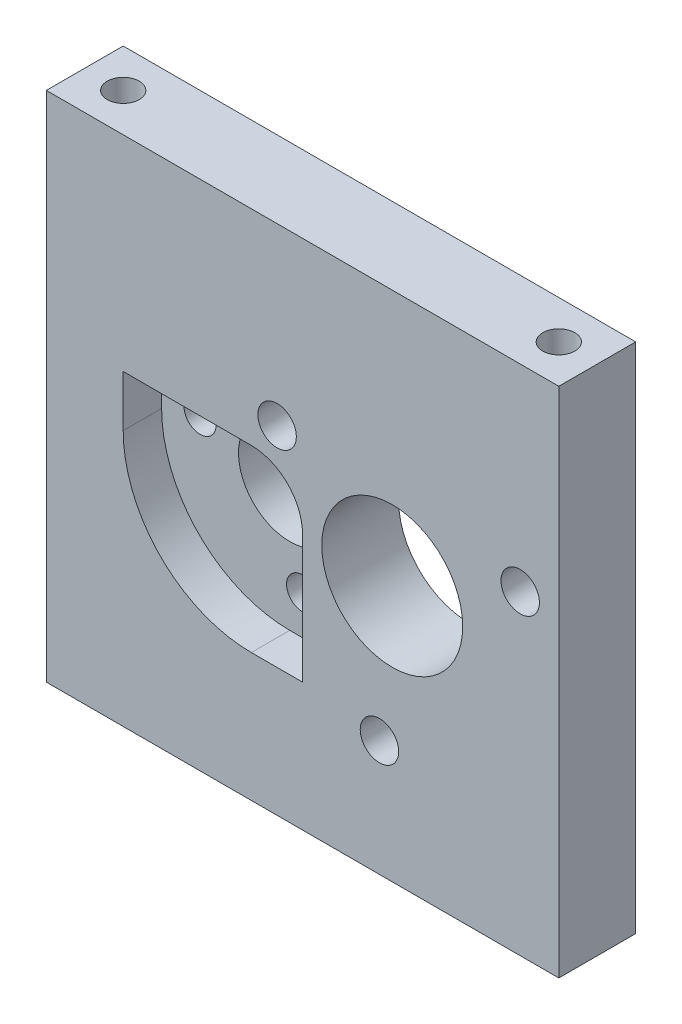
ISO-10303-21;
HEADER;
FILE_DESCRIPTION(('STEP AP214'),'2;1');
FILE_NAME('part.step','',(''),(''),'','','');
FILE_SCHEMA(('AUTOMOTIVE_DESIGN { 1 0 10303 214 1 1 1 1 }'));
ENDSEC;
DATA;
#1=APPLICATION_CONTEXT('core data for automotive mechanical design processes');
#2=APPLICATION_PROTOCOL_DEFINITION('international standard','automotive_design',2000,#1);
#3=PRODUCT_CONTEXT('',#1,'mechanical');
#4=PRODUCT('Part','Part','',(#3));
#5=PRODUCT_RELATED_PRODUCT_CATEGORY('part','',(#4));
#6=PRODUCT_DEFINITION_FORMATION('','',#4);
#7=PRODUCT_DEFINITION_CONTEXT('part definition',#1,'design');
#8=PRODUCT_DEFINITION('design','',#6,#7);
#9=PRODUCT_DEFINITION_SHAPE('','',#8);
#10=(LENGTH_UNIT() NAMED_UNIT(*) SI_UNIT(.MILLI.,.METRE.));
#11=(NAMED_UNIT(*) PLANE_ANGLE_UNIT() SI_UNIT($,.RADIAN.));
#12=(NAMED_UNIT(*) SI_UNIT($,.STERADIAN.) SOLID_ANGLE_UNIT());
#13=UNCERTAINTY_MEASURE_WITH_UNIT(LENGTH_MEASURE(1.E-05),#10,'distance_accuracy_value','');
#14=(GEOMETRIC_REPRESENTATION_CONTEXT(3) GLOBAL_UNCERTAINTY_ASSIGNED_CONTEXT((#13)) GLOBAL_UNIT_ASSIGNED_CONTEXT((#10,
#11,#12)) REPRESENTATION_CONTEXT('',''));
#15=CARTESIAN_POINT('',(0.,0.,0.));
#16=DIRECTION('',(0.,0.,1.));
#17=DIRECTION('',(1.,0.,0.));
#18=AXIS2_PLACEMENT_3D('',#15,#16,#17);
#19=CARTESIAN_POINT('',(-16.,20.,-6.));
#20=DIRECTION('',(-1.,0.,0.));
#21=DIRECTION('',(0.,-1.,0.));
#22=AXIS2_PLACEMENT_3D('',#19,#20,#21);
#23=PLANE('',#22);
#24=DIRECTION('',(0.,-1.,0.));
#25=VECTOR('',#24,1.);
#26=CARTESIAN_POINT('',(-16.,20.,0.));
#27=LINE('',#26,#25);
#28=CARTESIAN_POINT('',(-16.,20.,0.));
#29=VERTEX_POINT('',#28);
#30=CARTESIAN_POINT('',(-16.,-20.,0.));
#31=VERTEX_POINT('',#30);
#32=EDGE_CURVE('E244',#29,#31,#27,.T.);
#33=ORIENTED_EDGE('',*,*,#32,.F.);
#34=DIRECTION('',(0.,0.,1.));
#35=VECTOR('',#34,1.);
#36=CARTESIAN_POINT('',(-16.,20.,-6.));
#37=LINE('',#36,#35);
#38=CARTESIAN_POINT('',(-16.,20.,-6.));
#39=VERTEX_POINT('',#38);
#40=EDGE_CURVE('E43',#39,#29,#37,.T.);
#41=ORIENTED_EDGE('',*,*,#40,.F.);
#42=DIRECTION('',(0.,-1.,0.));
#43=VECTOR('',#42,1.);
#44=CARTESIAN_POINT('',(-16.,20.,-6.));
#45=LINE('',#44,#43);
#46=CARTESIAN_POINT('',(-16.,-20.,-6.));
#47=VERTEX_POINT('',#46);
#48=EDGE_CURVE('E245',#39,#47,#45,.T.);
#49=ORIENTED_EDGE('',*,*,#48,.T.);
#50=DIRECTION('',(0.,0.,1.));
#51=VECTOR('',#50,1.);
#52=CARTESIAN_POINT('',(-16.,-20.,-6.));
#53=LINE('',#52,#51);
#54=EDGE_CURVE('E84',#47,#31,#53,.T.);
#55=ORIENTED_EDGE('',*,*,#54,.T.);
#56=EDGE_LOOP('',(#33,#41,#49,#55));
#57=FACE_BOUND('',#56,.T.);
#58=ADVANCED_FACE('F36',(#57),#23,.T.);
#59=CARTESIAN_POINT('',(-16.,20.,-6.));
#60=DIRECTION('',(0.,1.,0.));
#61=DIRECTION('',(0.,0.,1.));
#62=AXIS2_PLACEMENT_3D('',#59,#60,#61);
#63=PLANE('',#62);
#64=CARTESIAN_POINT('',(21.,20.,-3.));
#65=DIRECTION('',(0.,1.,0.));
#66=DIRECTION('',(-1.,0.,0.));
#67=AXIS2_PLACEMENT_3D('',#64,#65,#66);
#68=CIRCLE('',#67,1.25);
#69=CARTESIAN_POINT('',(19.75,20.,-3.));
#70=VERTEX_POINT('',#69);
#71=EDGE_CURVE('E156',#70,#70,#68,.T.);
#72=ORIENTED_EDGE('',*,*,#71,.F.);
#73=EDGE_LOOP('',(#72));
#74=FACE_BOUND('',#73,.T.);
#75=CARTESIAN_POINT('',(-13.,20.,-3.));
#76=DIRECTION('',(0.,1.,0.));
#77=DIRECTION('',(-1.,0.,0.));
#78=AXIS2_PLACEMENT_3D('',#75,#76,#77);
#79=CIRCLE('',#78,1.25);
#80=CARTESIAN_POINT('',(-14.25,20.,-3.));
#81=VERTEX_POINT('',#80);
#82=EDGE_CURVE('E159',#81,#81,#79,.T.);
#83=ORIENTED_EDGE('',*,*,#82,.F.);
#84=EDGE_LOOP('',(#83));
#85=FACE_BOUND('',#84,.T.);
#86=DIRECTION('',(-1.,0.,0.));
#87=VECTOR('',#86,1.);
#88=CARTESIAN_POINT('',(-16.,20.,0.));
#89=LINE('',#88,#87);
#90=CARTESIAN_POINT('',(24.,20.,0.));
#91=VERTEX_POINT('',#90);
#92=EDGE_CURVE('E248',#91,#29,#89,.T.);
#93=ORIENTED_EDGE('',*,*,#92,.F.);
#94=DIRECTION('',(0.,0.,1.));
#95=VECTOR('',#94,1.);
#96=CARTESIAN_POINT('',(24.,20.,-6.));
#97=LINE('',#96,#95);
#98=CARTESIAN_POINT('',(24.,20.,-6.));
#99=VERTEX_POINT('',#98);
#100=EDGE_CURVE('E266',#99,#91,#97,.T.);
#101=ORIENTED_EDGE('',*,*,#100,.F.);
#102=DIRECTION('',(-1.,0.,0.));
#103=VECTOR('',#102,1.);
#104=CARTESIAN_POINT('',(-16.,20.,-6.));
#105=LINE('',#104,#103);
#106=EDGE_CURVE('E253',#99,#39,#105,.T.);
#107=ORIENTED_EDGE('',*,*,#106,.T.);
#108=ORIENTED_EDGE('',*,*,#40,.T.);
#109=EDGE_LOOP('',(#93,#101,#107,#108));
#110=FACE_BOUND('',#109,.T.);
#111=ADVANCED_FACE('F273',(#74,#85,#110),#63,.T.);
#112=CARTESIAN_POINT('',(24.,20.,-6.));
#113=DIRECTION('',(1.,0.,0.));
#114=DIRECTION('',(0.,1.,0.));
#115=AXIS2_PLACEMENT_3D('',#112,#113,#114);
#116=PLANE('',#115);
#117=DIRECTION('',(0.,1.,0.));
#118=VECTOR('',#117,1.);
#119=CARTESIAN_POINT('',(24.,20.,0.));
#120=LINE('',#119,#118);
#121=CARTESIAN_POINT('',(24.,-20.,0.));
#122=VERTEX_POINT('',#121);
#123=EDGE_CURVE('E260',#122,#91,#120,.T.);
#124=ORIENTED_EDGE('',*,*,#123,.F.);
#125=DIRECTION('',(0.,0.,1.));
#126=VECTOR('',#125,1.);
#127=CARTESIAN_POINT('',(24.,-20.,-6.));
#128=LINE('',#127,#126);
#129=CARTESIAN_POINT('',(24.,-20.,-6.));
#130=VERTEX_POINT('',#129);
#131=EDGE_CURVE('E268',#130,#122,#128,.T.);
#132=ORIENTED_EDGE('',*,*,#131,.F.);
#133=DIRECTION('',(0.,1.,0.));
#134=VECTOR('',#133,1.);
#135=CARTESIAN_POINT('',(24.,20.,-6.));
#136=LINE('',#135,#134);
#137=EDGE_CURVE('E250',#130,#99,#136,.T.);
#138=ORIENTED_EDGE('',*,*,#137,.T.);
#139=ORIENTED_EDGE('',*,*,#100,.T.);
#140=EDGE_LOOP('',(#124,#132,#138,#139));
#141=FACE_BOUND('',#140,.T.);
#142=ADVANCED_FACE('F277',(#141),#116,.T.);
#143=CARTESIAN_POINT('',(-16.,-20.,-6.));
#144=DIRECTION('',(0.,-1.,0.));
#145=DIRECTION('',(0.,0.,-1.));
#146=AXIS2_PLACEMENT_3D('',#143,#144,#145);
#147=PLANE('',#146);
#148=CARTESIAN_POINT('',(21.,-20.,-3.));
#149=DIRECTION('',(0.,-1.,0.));
#150=DIRECTION('',(0.,0.,-1.));
#151=AXIS2_PLACEMENT_3D('',#148,#149,#150);
#152=CIRCLE('',#151,1.25);
#153=CARTESIAN_POINT('',(21.,-20.,-4.25));
#154=VERTEX_POINT('',#153);
#155=EDGE_CURVE('E150',#154,#154,#152,.T.);
#156=ORIENTED_EDGE('',*,*,#155,.F.);
#157=EDGE_LOOP('',(#156));
#158=FACE_BOUND('',#157,.T.);
#159=CARTESIAN_POINT('',(-13.,-20.,-3.));
#160=DIRECTION('',(0.,-1.,0.));
#161=DIRECTION('',(0.,0.,-1.));
#162=AXIS2_PLACEMENT_3D('',#159,#160,#161);
#163=CIRCLE('',#162,1.25);
#164=CARTESIAN_POINT('',(-13.,-20.,-4.25));
#165=VERTEX_POINT('',#164);
#166=EDGE_CURVE('E153',#165,#165,#163,.T.);
#167=ORIENTED_EDGE('',*,*,#166,.F.);
#168=EDGE_LOOP('',(#167));
#169=FACE_BOUND('',#168,.T.);
#170=DIRECTION('',(1.,0.,0.));
#171=VECTOR('',#170,1.);
#172=CARTESIAN_POINT('',(-16.,-20.,0.));
#173=LINE('',#172,#171);
#174=EDGE_CURVE('E257',#31,#122,#173,.T.);
#175=ORIENTED_EDGE('',*,*,#174,.F.);
#176=ORIENTED_EDGE('',*,*,#54,.F.);
#177=DIRECTION('',(1.,0.,0.));
#178=VECTOR('',#177,1.);
#179=CARTESIAN_POINT('',(-16.,-20.,-6.));
#180=LINE('',#179,#178);
#181=EDGE_CURVE('E247',#47,#130,#180,.T.);
#182=ORIENTED_EDGE('',*,*,#181,.T.);
#183=ORIENTED_EDGE('',*,*,#131,.T.);
#184=EDGE_LOOP('',(#175,#176,#182,#183));
#185=FACE_BOUND('',#184,.T.);
#186=ADVANCED_FACE('F269',(#158,#169,#185),#147,.T.);
#187=CARTESIAN_POINT('',(-16.,-20.,-6.));
#188=DIRECTION('',(0.,0.,1.));
#189=DIRECTION('',(1.,0.,0.));
#190=AXIS2_PLACEMENT_3D('',#187,#188,#189);
#191=PLANE('',#190);
#192=CARTESIAN_POINT('',(0.,0.,-6.));
#193=DIRECTION('',(0.,0.,1.));
#194=DIRECTION('',(1.,0.,0.));
#195=AXIS2_PLACEMENT_3D('',#192,#193,#194);
#196=CIRCLE('',#195,4.);
#197=CARTESIAN_POINT('',(4.,0.,-6.));
#198=VERTEX_POINT('',#197);
#199=EDGE_CURVE('E162',#198,#198,#196,.F.);
#200=ORIENTED_EDGE('',*,*,#199,.F.);
#201=EDGE_LOOP('',(#200));
#202=FACE_BOUND('',#201,.T.);
#203=CARTESIAN_POINT('',(-7.,0.999999999999999,-6.));
#204=DIRECTION('',(0.,0.,1.));
#205=DIRECTION('',(1.,0.,0.));
#206=AXIS2_PLACEMENT_3D('',#203,#204,#205);
#207=CIRCLE('',#206,1.25);
#208=CARTESIAN_POINT('',(-5.75,0.999999999999999,-6.));
#209=VERTEX_POINT('',#208);
#210=EDGE_CURVE('E168',#209,#209,#207,.F.);
#211=ORIENTED_EDGE('',*,*,#210,.F.);
#212=EDGE_LOOP('',(#211));
#213=FACE_BOUND('',#212,.T.);
#214=CARTESIAN_POINT('',(1.,-7.,-6.));
#215=DIRECTION('',(0.,0.,1.));
#216=DIRECTION('',(1.,0.,0.));
#217=AXIS2_PLACEMENT_3D('',#214,#215,#216);
#218=CIRCLE('',#217,1.25);
#219=CARTESIAN_POINT('',(2.25,-7.,-6.));
#220=VERTEX_POINT('',#219);
#221=EDGE_CURVE('E174',#220,#220,#218,.F.);
#222=ORIENTED_EDGE('',*,*,#221,.F.);
#223=EDGE_LOOP('',(#222));
#224=FACE_BOUND('',#223,.T.);
#225=CARTESIAN_POINT('',(2.01316701949481,6.34325097883602,-6.));
#226=DIRECTION('',(0.,0.,-1.));
#227=DIRECTION('',(0.499999999999992,0.866025403784443,0.));
#228=AXIS2_PLACEMENT_3D('',#225,#226,#227);
#229=CIRCLE('',#228,1.5);
#230=CARTESIAN_POINT('',(2.7631670194948,7.64228908451268,-6.));
#231=VERTEX_POINT('',#230);
#232=EDGE_CURVE('E211',#231,#231,#229,.T.);
#233=ORIENTED_EDGE('',*,*,#232,.F.);
#234=EDGE_LOOP('',(#233));
#235=FACE_BOUND('',#234,.T.);
#236=CARTESIAN_POINT('',(20.9868329805051,4.61120017126727,-6.));
#237=DIRECTION('',(0.,0.,-1.));
#238=DIRECTION('',(0.500000000000004,-0.866025403784436,0.));
#239=AXIS2_PLACEMENT_3D('',#236,#237,#238);
#240=CIRCLE('',#239,1.5);
#241=CARTESIAN_POINT('',(21.7368329805051,3.31216206559061,-6.));
#242=VERTEX_POINT('',#241);
#243=EDGE_CURVE('E226',#242,#242,#240,.T.);
#244=ORIENTED_EDGE('',*,*,#243,.F.);
#245=EDGE_LOOP('',(#244));
#246=FACE_BOUND('',#245,.T.);
#247=CARTESIAN_POINT('',(10.,-10.9544511501033,-6.));
#248=DIRECTION('',(0.,0.,-1.));
#249=DIRECTION('',(-1.,0.,0.));
#250=AXIS2_PLACEMENT_3D('',#247,#248,#249);
#251=CIRCLE('',#250,1.5);
#252=CARTESIAN_POINT('',(8.49999999999999,-10.9544511501033,-6.));
#253=VERTEX_POINT('',#252);
#254=EDGE_CURVE('E232',#253,#253,#251,.T.);
#255=ORIENTED_EDGE('',*,*,#254,.F.);
#256=EDGE_LOOP('',(#255));
#257=FACE_BOUND('',#256,.T.);
#258=CARTESIAN_POINT('',(11.,0.,-6.));
#259=DIRECTION('',(0.,0.,-1.));
#260=DIRECTION('',(-1.,0.,0.));
#261=AXIS2_PLACEMENT_3D('',#258,#259,#260);
#262=CIRCLE('',#261,5.5);
#263=CARTESIAN_POINT('',(5.5,0.,-6.));
#264=VERTEX_POINT('',#263);
#265=EDGE_CURVE('E238',#264,#264,#262,.T.);
#266=ORIENTED_EDGE('',*,*,#265,.F.);
#267=EDGE_LOOP('',(#266));
#268=FACE_BOUND('',#267,.T.);
#269=ORIENTED_EDGE('',*,*,#48,.F.);
#270=ORIENTED_EDGE('',*,*,#106,.F.);
#271=ORIENTED_EDGE('',*,*,#137,.F.);
#272=ORIENTED_EDGE('',*,*,#181,.F.);
#273=EDGE_LOOP('',(#269,#270,#271,#272));
#274=FACE_BOUND('',#273,.T.);
#275=ADVANCED_FACE('F279',(#202,#213,#224,#235,#246,#257,#268,#274),#191,.F.);
#276=CARTESIAN_POINT('',(-16.,-20.,0.));
#277=DIRECTION('',(0.,0.,1.));
#278=DIRECTION('',(1.,0.,0.));
#279=AXIS2_PLACEMENT_3D('',#276,#277,#278);
#280=PLANE('',#279);
#281=CARTESIAN_POINT('',(0.,0.,0.));
#282=DIRECTION('',(0.,0.,1.));
#283=DIRECTION('',(-1.,0.,0.));
#284=AXIS2_PLACEMENT_3D('',#281,#282,#283);
#285=CIRCLE('',#284,4.);
#286=CARTESIAN_POINT('',(4.,0.,0.));
#287=VERTEX_POINT('',#286);
#288=CARTESIAN_POINT('',(0.,4.,0.));
#289=VERTEX_POINT('',#288);
#290=EDGE_CURVE('E50',#287,#289,#285,.T.);
#291=ORIENTED_EDGE('',*,*,#290,.F.);
#292=DIRECTION('',(0.,1.,0.));
#293=VECTOR('',#292,1.);
#294=CARTESIAN_POINT('',(4.,0.,0.));
#295=LINE('',#294,#293);
#296=CARTESIAN_POINT('',(4.,-10.,0.));
#297=VERTEX_POINT('',#296);
#298=EDGE_CURVE('E181',#297,#287,#295,.T.);
#299=ORIENTED_EDGE('',*,*,#298,.F.);
#300=DIRECTION('',(1.,0.,0.));
#301=VECTOR('',#300,1.);
#302=CARTESIAN_POINT('',(4.,-10.,0.));
#303=LINE('',#302,#301);
#304=CARTESIAN_POINT('',(0.,-10.,0.));
#305=VERTEX_POINT('',#304);
#306=EDGE_CURVE('E204',#305,#297,#303,.T.);
#307=ORIENTED_EDGE('',*,*,#306,.F.);
#308=CARTESIAN_POINT('',(0.,0.,0.));
#309=DIRECTION('',(0.,0.,1.));
#310=DIRECTION('',(1.,0.,0.));
#311=AXIS2_PLACEMENT_3D('',#308,#309,#310);
#312=CIRCLE('',#311,10.);
#313=CARTESIAN_POINT('',(-10.,0.,0.));
#314=VERTEX_POINT('',#313);
#315=EDGE_CURVE('E201',#314,#305,#312,.T.);
#316=ORIENTED_EDGE('',*,*,#315,.F.);
#317=DIRECTION('',(0.,-1.,0.));
#318=VECTOR('',#317,1.);
#319=CARTESIAN_POINT('',(-10.,4.,0.));
#320=LINE('',#319,#318);
#321=CARTESIAN_POINT('',(-10.,4.,0.));
#322=VERTEX_POINT('',#321);
#323=EDGE_CURVE('E198',#322,#314,#320,.T.);
#324=ORIENTED_EDGE('',*,*,#323,.F.);
#325=DIRECTION('',(-1.,0.,0.));
#326=VECTOR('',#325,1.);
#327=CARTESIAN_POINT('',(0.,4.,0.));
#328=LINE('',#327,#326);
#329=EDGE_CURVE('E195',#289,#322,#328,.T.);
#330=ORIENTED_EDGE('',*,*,#329,.F.);
#331=EDGE_LOOP('',(#291,#299,#307,#316,#324,#330));
#332=FACE_BOUND('',#331,.T.);
#333=CARTESIAN_POINT('',(2.01316701949481,6.34325097883602,0.));
#334=DIRECTION('',(0.,0.,1.));
#335=DIRECTION('',(1.,0.,0.));
#336=AXIS2_PLACEMENT_3D('',#333,#334,#335);
#337=CIRCLE('',#336,1.5);
#338=CARTESIAN_POINT('',(3.51316701949481,6.34325097883602,0.));
#339=VERTEX_POINT('',#338);
#340=EDGE_CURVE('E223',#339,#339,#337,.F.);
#341=ORIENTED_EDGE('',*,*,#340,.T.);
#342=EDGE_LOOP('',(#341));
#343=FACE_BOUND('',#342,.T.);
#344=CARTESIAN_POINT('',(20.9868329805051,4.61120017126727,0.));
#345=DIRECTION('',(0.,0.,1.));
#346=DIRECTION('',(1.,0.,0.));
#347=AXIS2_PLACEMENT_3D('',#344,#345,#346);
#348=CIRCLE('',#347,1.5);
#349=CARTESIAN_POINT('',(22.4868329805051,4.61120017126727,0.));
#350=VERTEX_POINT('',#349);
#351=EDGE_CURVE('E229',#350,#350,#348,.F.);
#352=ORIENTED_EDGE('',*,*,#351,.T.);
#353=EDGE_LOOP('',(#352));
#354=FACE_BOUND('',#353,.T.);
#355=CARTESIAN_POINT('',(10.,-10.9544511501033,0.));
#356=DIRECTION('',(0.,0.,1.));
#357=DIRECTION('',(1.,0.,0.));
#358=AXIS2_PLACEMENT_3D('',#355,#356,#357);
#359=CIRCLE('',#358,1.5);
#360=CARTESIAN_POINT('',(11.5,-10.9544511501033,0.));
#361=VERTEX_POINT('',#360);
#362=EDGE_CURVE('E235',#361,#361,#359,.F.);
#363=ORIENTED_EDGE('',*,*,#362,.T.);
#364=EDGE_LOOP('',(#363));
#365=FACE_BOUND('',#364,.T.);
#366=CARTESIAN_POINT('',(11.,0.,0.));
#367=DIRECTION('',(0.,0.,1.));
#368=DIRECTION('',(1.,0.,0.));
#369=AXIS2_PLACEMENT_3D('',#366,#367,#368);
#370=CIRCLE('',#369,5.5);
#371=CARTESIAN_POINT('',(16.5,0.,0.));
#372=VERTEX_POINT('',#371);
#373=EDGE_CURVE('E241',#372,#372,#370,.F.);
#374=ORIENTED_EDGE('',*,*,#373,.T.);
#375=EDGE_LOOP('',(#374));
#376=FACE_BOUND('',#375,.T.);
#377=ORIENTED_EDGE('',*,*,#32,.T.);
#378=ORIENTED_EDGE('',*,*,#174,.T.);
#379=ORIENTED_EDGE('',*,*,#123,.T.);
#380=ORIENTED_EDGE('',*,*,#92,.T.);
#381=EDGE_LOOP('',(#377,#378,#379,#380));
#382=FACE_BOUND('',#381,.T.);
#383=ADVANCED_FACE('F272',(#332,#343,#354,#365,#376,#382),#280,.T.);
#384=CARTESIAN_POINT('',(11.,0.,15.556349186104));
#385=DIRECTION('',(0.,0.,-1.));
#386=DIRECTION('',(-1.,0.,0.));
#387=AXIS2_PLACEMENT_3D('',#384,#385,#386);
#388=CYLINDRICAL_SURFACE('',#387,5.5);
#389=ORIENTED_EDGE('',*,*,#265,.T.);
#390=EDGE_LOOP('',(#389));
#391=FACE_BOUND('',#390,.T.);
#392=ORIENTED_EDGE('',*,*,#373,.F.);
#393=EDGE_LOOP('',(#392));
#394=FACE_BOUND('',#393,.T.);
#395=ADVANCED_FACE('F287',(#391,#394),#388,.F.);
#396=CARTESIAN_POINT('',(10.,-10.9544511501033,4.2426406871193));
#397=DIRECTION('',(0.,0.,-1.));
#398=DIRECTION('',(-1.,0.,0.));
#399=AXIS2_PLACEMENT_3D('',#396,#397,#398);
#400=CYLINDRICAL_SURFACE('',#399,1.5);
#401=ORIENTED_EDGE('',*,*,#254,.T.);
#402=EDGE_LOOP('',(#401));
#403=FACE_BOUND('',#402,.T.);
#404=ORIENTED_EDGE('',*,*,#362,.F.);
#405=EDGE_LOOP('',(#404));
#406=FACE_BOUND('',#405,.T.);
#407=ADVANCED_FACE('F362',(#403,#406),#400,.F.);
#408=CARTESIAN_POINT('',(20.9868329805051,4.61120017126727,4.2426406871193));
#409=DIRECTION('',(0.,0.,-1.));
#410=DIRECTION('',(-1.,0.,0.));
#411=AXIS2_PLACEMENT_3D('',#408,#409,#410);
#412=CYLINDRICAL_SURFACE('',#411,1.5);
#413=ORIENTED_EDGE('',*,*,#243,.T.);
#414=EDGE_LOOP('',(#413));
#415=FACE_BOUND('',#414,.T.);
#416=ORIENTED_EDGE('',*,*,#351,.F.);
#417=EDGE_LOOP('',(#416));
#418=FACE_BOUND('',#417,.T.);
#419=ADVANCED_FACE('F358',(#415,#418),#412,.F.);
#420=CARTESIAN_POINT('',(2.01316701949481,6.34325097883602,4.2426406871193));
#421=DIRECTION('',(0.,0.,-1.));
#422=DIRECTION('',(-1.,0.,0.));
#423=AXIS2_PLACEMENT_3D('',#420,#421,#422);
#424=CYLINDRICAL_SURFACE('',#423,1.5);
#425=ORIENTED_EDGE('',*,*,#232,.T.);
#426=EDGE_LOOP('',(#425));
#427=FACE_BOUND('',#426,.T.);
#428=ORIENTED_EDGE('',*,*,#340,.F.);
#429=EDGE_LOOP('',(#428));
#430=FACE_BOUND('',#429,.T.);
#431=ADVANCED_FACE('F355',(#427,#430),#424,.F.);
#432=CARTESIAN_POINT('',(0.,0.,-3.));
#433=DIRECTION('',(0.,0.,1.));
#434=DIRECTION('',(1.,0.,0.));
#435=AXIS2_PLACEMENT_3D('',#432,#433,#434);
#436=CYLINDRICAL_SURFACE('',#435,4.);
#437=ORIENTED_EDGE('',*,*,#290,.T.);
#438=DIRECTION('',(0.,0.,1.));
#439=VECTOR('',#438,1.);
#440=CARTESIAN_POINT('',(0.,4.,-3.));
#441=LINE('',#440,#439);
#442=CARTESIAN_POINT('',(0.,4.,-3.));
#443=VERTEX_POINT('',#442);
#444=EDGE_CURVE('E193',#443,#289,#441,.T.);
#445=ORIENTED_EDGE('',*,*,#444,.F.);
#446=CARTESIAN_POINT('',(0.,0.,-3.));
#447=DIRECTION('',(0.,0.,-1.));
#448=DIRECTION('',(-1.,0.,0.));
#449=AXIS2_PLACEMENT_3D('',#446,#447,#448);
#450=CIRCLE('',#449,4.);
#451=CARTESIAN_POINT('',(4.,0.,-3.));
#452=VERTEX_POINT('',#451);
#453=EDGE_CURVE('E11',#452,#443,#450,.T.);
#454=ORIENTED_EDGE('',*,*,#453,.F.);
#455=DIRECTION('',(0.,0.,1.));
#456=VECTOR('',#455,1.);
#457=CARTESIAN_POINT('',(4.,0.,-3.));
#458=LINE('',#457,#456);
#459=EDGE_CURVE('E209',#452,#287,#458,.T.);
#460=ORIENTED_EDGE('',*,*,#459,.T.);
#461=EDGE_LOOP('',(#437,#445,#454,#460));
#462=FACE_BOUND('',#461,.T.);
#463=ORIENTED_EDGE('',*,*,#199,.T.);
#464=EDGE_LOOP('',(#463));
#465=FACE_BOUND('',#464,.T.);
#466=ADVANCED_FACE('F337',(#462,#465),#436,.F.);
#467=CARTESIAN_POINT('',(4.,0.,-3.));
#468=DIRECTION('',(1.,0.,0.));
#469=DIRECTION('',(0.,1.,0.));
#470=AXIS2_PLACEMENT_3D('',#467,#468,#469);
#471=PLANE('',#470);
#472=ORIENTED_EDGE('',*,*,#298,.T.);
#473=ORIENTED_EDGE('',*,*,#459,.F.);
#474=DIRECTION('',(0.,1.,0.));
#475=VECTOR('',#474,1.);
#476=CARTESIAN_POINT('',(4.,0.,-3.));
#477=LINE('',#476,#475);
#478=CARTESIAN_POINT('',(4.,-10.,-3.));
#479=VERTEX_POINT('',#478);
#480=EDGE_CURVE('E190',#479,#452,#477,.T.);
#481=ORIENTED_EDGE('',*,*,#480,.F.);
#482=DIRECTION('',(0.,0.,1.));
#483=VECTOR('',#482,1.);
#484=CARTESIAN_POINT('',(4.,-10.,-3.));
#485=LINE('',#484,#483);
#486=EDGE_CURVE('E212',#479,#297,#485,.T.);
#487=ORIENTED_EDGE('',*,*,#486,.T.);
#488=EDGE_LOOP('',(#472,#473,#481,#487));
#489=FACE_BOUND('',#488,.T.);
#490=ADVANCED_FACE('F333',(#489),#471,.F.);
#491=CARTESIAN_POINT('',(4.,-10.,-3.));
#492=DIRECTION('',(0.,-1.,0.));
#493=DIRECTION('',(0.,0.,-1.));
#494=AXIS2_PLACEMENT_3D('',#491,#492,#493);
#495=PLANE('',#494);
#496=ORIENTED_EDGE('',*,*,#306,.T.);
#497=ORIENTED_EDGE('',*,*,#486,.F.);
#498=DIRECTION('',(1.,0.,0.));
#499=VECTOR('',#498,1.);
#500=CARTESIAN_POINT('',(4.,-10.,-3.));
#501=LINE('',#500,#499);
#502=CARTESIAN_POINT('',(0.,-10.,-3.));
#503=VERTEX_POINT('',#502);
#504=EDGE_CURVE('E187',#503,#479,#501,.T.);
#505=ORIENTED_EDGE('',*,*,#504,.F.);
#506=DIRECTION('',(0.,0.,1.));
#507=VECTOR('',#506,1.);
#508=CARTESIAN_POINT('',(0.,-10.,-3.));
#509=LINE('',#508,#507);
#510=EDGE_CURVE('E214',#503,#305,#509,.T.);
#511=ORIENTED_EDGE('',*,*,#510,.T.);
#512=EDGE_LOOP('',(#496,#497,#505,#511));
#513=FACE_BOUND('',#512,.T.);
#514=ADVANCED_FACE('F336',(#513),#495,.F.);
#515=CARTESIAN_POINT('',(0.,0.,-3.));
#516=DIRECTION('',(0.,0.,1.));
#517=DIRECTION('',(1.,0.,0.));
#518=AXIS2_PLACEMENT_3D('',#515,#516,#517);
#519=CYLINDRICAL_SURFACE('',#518,10.);
#520=ORIENTED_EDGE('',*,*,#315,.T.);
#521=ORIENTED_EDGE('',*,*,#510,.F.);
#522=CARTESIAN_POINT('',(0.,0.,-3.));
#523=DIRECTION('',(0.,0.,1.));
#524=DIRECTION('',(1.,0.,0.));
#525=AXIS2_PLACEMENT_3D('',#522,#523,#524);
#526=CIRCLE('',#525,10.);
#527=CARTESIAN_POINT('',(-10.,0.,-3.));
#528=VERTEX_POINT('',#527);
#529=EDGE_CURVE('E184',#528,#503,#526,.T.);
#530=ORIENTED_EDGE('',*,*,#529,.F.);
#531=DIRECTION('',(0.,0.,1.));
#532=VECTOR('',#531,1.);
#533=CARTESIAN_POINT('',(-10.,0.,-3.));
#534=LINE('',#533,#532);
#535=EDGE_CURVE('E216',#528,#314,#534,.T.);
#536=ORIENTED_EDGE('',*,*,#535,.T.);
#537=EDGE_LOOP('',(#520,#521,#530,#536));
#538=FACE_BOUND('',#537,.T.);
#539=ADVANCED_FACE('F341',(#538),#519,.F.);
#540=CARTESIAN_POINT('',(-10.,4.,-3.));
#541=DIRECTION('',(-1.,0.,0.));
#542=DIRECTION('',(0.,0.,1.));
#543=AXIS2_PLACEMENT_3D('',#540,#541,#542);
#544=PLANE('',#543);
#545=ORIENTED_EDGE('',*,*,#323,.T.);
#546=ORIENTED_EDGE('',*,*,#535,.F.);
#547=DIRECTION('',(0.,-1.,0.));
#548=VECTOR('',#547,1.);
#549=CARTESIAN_POINT('',(-10.,4.,-3.));
#550=LINE('',#549,#548);
#551=CARTESIAN_POINT('',(-10.,4.,-3.));
#552=VERTEX_POINT('',#551);
#553=EDGE_CURVE('E180',#552,#528,#550,.T.);
#554=ORIENTED_EDGE('',*,*,#553,.F.);
#555=DIRECTION('',(0.,0.,1.));
#556=VECTOR('',#555,1.);
#557=CARTESIAN_POINT('',(-10.,4.,-3.));
#558=LINE('',#557,#556);
#559=EDGE_CURVE('E218',#552,#322,#558,.T.);
#560=ORIENTED_EDGE('',*,*,#559,.T.);
#561=EDGE_LOOP('',(#545,#546,#554,#560));
#562=FACE_BOUND('',#561,.T.);
#563=ADVANCED_FACE('F345',(#562),#544,.F.);
#564=CARTESIAN_POINT('',(0.,4.,-3.));
#565=DIRECTION('',(0.,1.,0.));
#566=DIRECTION('',(-1.,0.,0.));
#567=AXIS2_PLACEMENT_3D('',#564,#565,#566);
#568=PLANE('',#567);
#569=ORIENTED_EDGE('',*,*,#329,.T.);
#570=ORIENTED_EDGE('',*,*,#559,.F.);
#571=DIRECTION('',(-1.,0.,0.));
#572=VECTOR('',#571,1.);
#573=CARTESIAN_POINT('',(0.,4.,-3.));
#574=LINE('',#573,#572);
#575=EDGE_CURVE('E177',#443,#552,#574,.T.);
#576=ORIENTED_EDGE('',*,*,#575,.F.);
#577=ORIENTED_EDGE('',*,*,#444,.T.);
#578=EDGE_LOOP('',(#569,#570,#576,#577));
#579=FACE_BOUND('',#578,.T.);
#580=ADVANCED_FACE('F331',(#579),#568,.F.);
#581=CARTESIAN_POINT('',(0.,0.,-3.));
#582=DIRECTION('',(0.,0.,-1.));
#583=DIRECTION('',(-1.,0.,0.));
#584=AXIS2_PLACEMENT_3D('',#581,#582,#583);
#585=PLANE('',#584);
#586=CARTESIAN_POINT('',(-7.,0.999999999999999,-3.));
#587=DIRECTION('',(0.,0.,1.));
#588=DIRECTION('',(1.,0.,0.));
#589=AXIS2_PLACEMENT_3D('',#586,#587,#588);
#590=CIRCLE('',#589,1.25);
#591=CARTESIAN_POINT('',(-5.75,0.999999999999999,-3.));
#592=VERTEX_POINT('',#591);
#593=EDGE_CURVE('E165',#592,#592,#590,.T.);
#594=ORIENTED_EDGE('',*,*,#593,.F.);
#595=EDGE_LOOP('',(#594));
#596=FACE_BOUND('',#595,.T.);
#597=CARTESIAN_POINT('',(1.,-7.,-3.));
#598=DIRECTION('',(0.,0.,1.));
#599=DIRECTION('',(1.,0.,0.));
#600=AXIS2_PLACEMENT_3D('',#597,#598,#599);
#601=CIRCLE('',#600,1.25);
#602=CARTESIAN_POINT('',(2.25,-7.,-3.));
#603=VERTEX_POINT('',#602);
#604=EDGE_CURVE('E171',#603,#603,#601,.T.);
#605=ORIENTED_EDGE('',*,*,#604,.F.);
#606=EDGE_LOOP('',(#605));
#607=FACE_BOUND('',#606,.T.);
#608=ORIENTED_EDGE('',*,*,#480,.T.);
#609=ORIENTED_EDGE('',*,*,#453,.T.);
#610=ORIENTED_EDGE('',*,*,#575,.T.);
#611=ORIENTED_EDGE('',*,*,#553,.T.);
#612=ORIENTED_EDGE('',*,*,#529,.T.);
#613=ORIENTED_EDGE('',*,*,#504,.T.);
#614=EDGE_LOOP('',(#608,#609,#610,#611,#612,#613));
#615=FACE_BOUND('',#614,.T.);
#616=ADVANCED_FACE('F327',(#596,#607,#615),#585,.F.);
#617=CARTESIAN_POINT('',(1.,-7.,-9.53553390593274));
#618=DIRECTION('',(0.,0.,1.));
#619=DIRECTION('',(1.,0.,0.));
#620=AXIS2_PLACEMENT_3D('',#617,#618,#619);
#621=CYLINDRICAL_SURFACE('',#620,1.25);
#622=ORIENTED_EDGE('',*,*,#221,.T.);
#623=EDGE_LOOP('',(#622));
#624=FACE_BOUND('',#623,.T.);
#625=ORIENTED_EDGE('',*,*,#604,.T.);
#626=EDGE_LOOP('',(#625));
#627=FACE_BOUND('',#626,.T.);
#628=ADVANCED_FACE('F320',(#624,#627),#621,.F.);
#629=CARTESIAN_POINT('',(-7.,0.999999999999999,-9.53553390593274));
#630=DIRECTION('',(0.,0.,1.));
#631=DIRECTION('',(1.,0.,0.));
#632=AXIS2_PLACEMENT_3D('',#629,#630,#631);
#633=CYLINDRICAL_SURFACE('',#632,1.25);
#634=ORIENTED_EDGE('',*,*,#210,.T.);
#635=EDGE_LOOP('',(#634));
#636=FACE_BOUND('',#635,.T.);
#637=ORIENTED_EDGE('',*,*,#593,.T.);
#638=EDGE_LOOP('',(#637));
#639=FACE_BOUND('',#638,.T.);
#640=ADVANCED_FACE('F311',(#636,#639),#633,.F.);
#641=CARTESIAN_POINT('',(-13.,10.,-3.));
#642=DIRECTION('',(0.,1.,0.));
#643=DIRECTION('',(-1.,0.,0.));
#644=AXIS2_PLACEMENT_3D('',#641,#642,#643);
#645=CYLINDRICAL_SURFACE('',#644,1.25);
#646=CARTESIAN_POINT('',(-13.,10.,-3.));
#647=DIRECTION('',(0.,1.,0.));
#648=DIRECTION('',(0.,0.,1.));
#649=AXIS2_PLACEMENT_3D('',#646,#647,#648);
#650=CIRCLE('',#649,1.24999999999999);
#651=CARTESIAN_POINT('',(-13.,10.,-1.75000000000001));
#652=VERTEX_POINT('',#651);
#653=EDGE_CURVE('E137',#652,#652,#650,.T.);
#654=ORIENTED_EDGE('',*,*,#653,.F.);
#655=EDGE_LOOP('',(#654));
#656=FACE_BOUND('',#655,.T.);
#657=ORIENTED_EDGE('',*,*,#82,.T.);
#658=EDGE_LOOP('',(#657));
#659=FACE_BOUND('',#658,.T.);
#660=ADVANCED_FACE('F308',(#656,#659),#645,.F.);
#661=CARTESIAN_POINT('',(21.,10.,-3.));
#662=DIRECTION('',(0.,1.,0.));
#663=DIRECTION('',(-1.,0.,0.));
#664=AXIS2_PLACEMENT_3D('',#661,#662,#663);
#665=CYLINDRICAL_SURFACE('',#664,1.25);
#666=CARTESIAN_POINT('',(21.,10.,-3.));
#667=DIRECTION('',(0.,1.,0.));
#668=DIRECTION('',(0.,0.,1.));
#669=AXIS2_PLACEMENT_3D('',#666,#667,#668);
#670=CIRCLE('',#669,1.24999999999999);
#671=CARTESIAN_POINT('',(21.,10.,-1.75000000000001));
#672=VERTEX_POINT('',#671);
#673=EDGE_CURVE('E139',#672,#672,#670,.T.);
#674=ORIENTED_EDGE('',*,*,#673,.F.);
#675=EDGE_LOOP('',(#674));
#676=FACE_BOUND('',#675,.T.);
#677=ORIENTED_EDGE('',*,*,#71,.T.);
#678=EDGE_LOOP('',(#677));
#679=FACE_BOUND('',#678,.T.);
#680=ADVANCED_FACE('F310',(#676,#679),#665,.F.);
#681=CARTESIAN_POINT('',(-13.,-10.,-3.));
#682=DIRECTION('',(0.,-1.,0.));
#683=DIRECTION('',(0.,0.,-1.));
#684=AXIS2_PLACEMENT_3D('',#681,#682,#683);
#685=CYLINDRICAL_SURFACE('',#684,1.25);
#686=CARTESIAN_POINT('',(-13.,-10.,-3.));
#687=DIRECTION('',(0.,-1.,0.));
#688=DIRECTION('',(0.,0.,-1.));
#689=AXIS2_PLACEMENT_3D('',#686,#687,#688);
#690=CIRCLE('',#689,1.24999999999999);
#691=CARTESIAN_POINT('',(-13.,-10.,-4.24999999999999));
#692=VERTEX_POINT('',#691);
#693=EDGE_CURVE('E142',#692,#692,#690,.T.);
#694=ORIENTED_EDGE('',*,*,#693,.F.);
#695=EDGE_LOOP('',(#694));
#696=FACE_BOUND('',#695,.T.);
#697=ORIENTED_EDGE('',*,*,#166,.T.);
#698=EDGE_LOOP('',(#697));
#699=FACE_BOUND('',#698,.T.);
#700=ADVANCED_FACE('F317',(#696,#699),#685,.F.);
#701=CARTESIAN_POINT('',(21.,-10.,-3.));
#702=DIRECTION('',(0.,-1.,0.));
#703=DIRECTION('',(0.,0.,-1.));
#704=AXIS2_PLACEMENT_3D('',#701,#702,#703);
#705=CYLINDRICAL_SURFACE('',#704,1.25);
#706=CARTESIAN_POINT('',(21.,-10.,-3.));
#707=DIRECTION('',(0.,-1.,0.));
#708=DIRECTION('',(0.,0.,-1.));
#709=AXIS2_PLACEMENT_3D('',#706,#707,#708);
#710=CIRCLE('',#709,1.24999999999999);
#711=CARTESIAN_POINT('',(21.,-10.,-4.24999999999999));
#712=VERTEX_POINT('',#711);
#713=EDGE_CURVE('E147',#712,#712,#710,.T.);
#714=ORIENTED_EDGE('',*,*,#713,.F.);
#715=EDGE_LOOP('',(#714));
#716=FACE_BOUND('',#715,.T.);
#717=ORIENTED_EDGE('',*,*,#155,.T.);
#718=EDGE_LOOP('',(#717));
#719=FACE_BOUND('',#718,.T.);
#720=ADVANCED_FACE('F497',(#716,#719),#705,.F.);
#721=CARTESIAN_POINT('',(21.,-10.,-3.));
#722=DIRECTION('',(0.,-1.,0.));
#723=DIRECTION('',(0.,0.,-1.));
#724=AXIS2_PLACEMENT_3D('',#721,#722,#723);
#725=CONICAL_SURFACE('',#724,1.24999999999999,1.02974425867664);
#726=CARTESIAN_POINT('',(21.,-9.24892422621555,-3.));
#727=VERTEX_POINT('',#726);
#728=VERTEX_LOOP('',#727);
#729=FACE_BOUND('',#728,.T.);
#730=ORIENTED_EDGE('',*,*,#713,.T.);
#731=EDGE_LOOP('',(#730));
#732=FACE_BOUND('',#731,.T.);
#733=ADVANCED_FACE('F506',(#729,#732),#725,.F.);
#734=CARTESIAN_POINT('',(-13.,-10.,-3.));
#735=DIRECTION('',(0.,-1.,0.));
#736=DIRECTION('',(0.,0.,-1.));
#737=AXIS2_PLACEMENT_3D('',#734,#735,#736);
#738=CONICAL_SURFACE('',#737,1.24999999999999,1.02974425867664);
#739=CARTESIAN_POINT('',(-13.,-9.24892422621555,-3.));
#740=VERTEX_POINT('',#739);
#741=VERTEX_LOOP('',#740);
#742=FACE_BOUND('',#741,.T.);
#743=ORIENTED_EDGE('',*,*,#693,.T.);
#744=EDGE_LOOP('',(#743));
#745=FACE_BOUND('',#744,.T.);
#746=ADVANCED_FACE('F516',(#742,#745),#738,.F.);
#747=CARTESIAN_POINT('',(21.,10.,-3.));
#748=DIRECTION('',(0.,1.,0.));
#749=DIRECTION('',(0.,0.,1.));
#750=AXIS2_PLACEMENT_3D('',#747,#748,#749);
#751=CONICAL_SURFACE('',#750,1.24999999999999,1.02974425867664);
#752=CARTESIAN_POINT('',(21.,9.24892422621555,-3.));
#753=VERTEX_POINT('',#752);
#754=VERTEX_LOOP('',#753);
#755=FACE_BOUND('',#754,.T.);
#756=ORIENTED_EDGE('',*,*,#673,.T.);
#757=EDGE_LOOP('',(#756));
#758=FACE_BOUND('',#757,.T.);
#759=ADVANCED_FACE('F133',(#755,#758),#751,.F.);
#760=CARTESIAN_POINT('',(-13.,10.,-3.));
#761=DIRECTION('',(0.,1.,0.));
#762=DIRECTION('',(0.,0.,1.));
#763=AXIS2_PLACEMENT_3D('',#760,#761,#762);
#764=CONICAL_SURFACE('',#763,1.24999999999999,1.02974425867664);
#765=CARTESIAN_POINT('',(-13.,9.24892422621555,-3.));
#766=VERTEX_POINT('',#765);
#767=VERTEX_LOOP('',#766);
#768=FACE_BOUND('',#767,.T.);
#769=ORIENTED_EDGE('',*,*,#653,.T.);
#770=EDGE_LOOP('',(#769));
#771=FACE_BOUND('',#770,.T.);
#772=ADVANCED_FACE('F130',(#768,#771),#764,.F.);
#773=CLOSED_SHELL('',(#58,#111,#142,#186,#275,#383,#395,#407,#419,#431,#466,#490,#514,#539,#563,
#580,#616,#628,#640,#660,#680,#700,#720,#733,#746,#759,#772));
#774=MANIFOLD_SOLID_BREP('B2',#773);
#775=ADVANCED_BREP_SHAPE_REPRESENTATION('',(#18,#774),#14);
#776=SHAPE_DEFINITION_REPRESENTATION(#9,#775);
ENDSEC;
END-ISO-10303-21;
